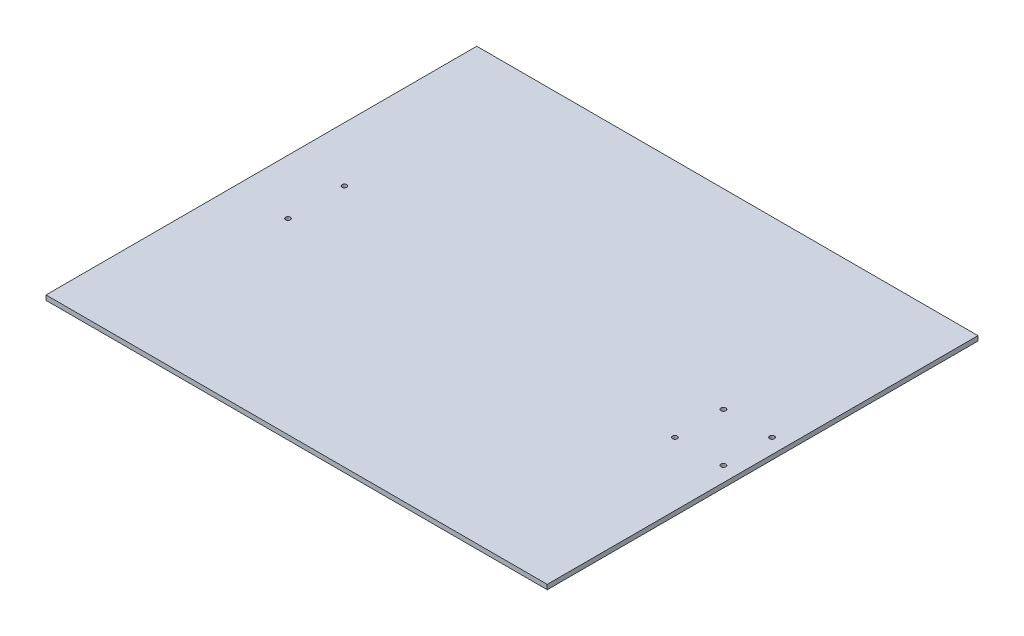
ISO-10303-21;
HEADER;
FILE_DESCRIPTION(('STEP AP214'),'2;1');
FILE_NAME('part.step','',(''),(''),'','','');
FILE_SCHEMA(('AUTOMOTIVE_DESIGN { 1 0 10303 214 1 1 1 1 }'));
ENDSEC;
DATA;
#1=APPLICATION_CONTEXT('core data for automotive mechanical design processes');
#2=APPLICATION_PROTOCOL_DEFINITION('international standard','automotive_design',2000,#1);
#3=PRODUCT_CONTEXT('',#1,'mechanical');
#4=PRODUCT('Part','Part','',(#3));
#5=PRODUCT_RELATED_PRODUCT_CATEGORY('part','',(#4));
#6=PRODUCT_DEFINITION_FORMATION('','',#4);
#7=PRODUCT_DEFINITION_CONTEXT('part definition',#1,'design');
#8=PRODUCT_DEFINITION('design','',#6,#7);
#9=PRODUCT_DEFINITION_SHAPE('','',#8);
#10=(LENGTH_UNIT() NAMED_UNIT(*) SI_UNIT(.MILLI.,.METRE.));
#11=(NAMED_UNIT(*) PLANE_ANGLE_UNIT() SI_UNIT($,.RADIAN.));
#12=(NAMED_UNIT(*) SI_UNIT($,.STERADIAN.) SOLID_ANGLE_UNIT());
#13=UNCERTAINTY_MEASURE_WITH_UNIT(LENGTH_MEASURE(1.E-05),#10,'distance_accuracy_value','');
#14=(GEOMETRIC_REPRESENTATION_CONTEXT(3) GLOBAL_UNCERTAINTY_ASSIGNED_CONTEXT((#13)) GLOBAL_UNIT_ASSIGNED_CONTEXT((#10,
#11,#12)) REPRESENTATION_CONTEXT('',''));
#15=CARTESIAN_POINT('',(0.,0.,0.));
#16=DIRECTION('',(0.,0.,1.));
#17=DIRECTION('',(1.,0.,0.));
#18=AXIS2_PLACEMENT_3D('',#15,#16,#17);
#19=CARTESIAN_POINT('',(160.,3.,137.5));
#20=DIRECTION('',(-1.,0.,0.));
#21=DIRECTION('',(0.,0.,1.));
#22=AXIS2_PLACEMENT_3D('',#19,#20,#21);
#23=PLANE('',#22);
#24=DIRECTION('',(0.,0.,-1.));
#25=VECTOR('',#24,1.);
#26=CARTESIAN_POINT('',(160.,0.,137.5));
#27=LINE('',#26,#25);
#28=CARTESIAN_POINT('',(160.,0.,137.5));
#29=VERTEX_POINT('',#28);
#30=CARTESIAN_POINT('',(160.,0.,-137.5));
#31=VERTEX_POINT('',#30);
#32=EDGE_CURVE('E99',#29,#31,#27,.T.);
#33=ORIENTED_EDGE('',*,*,#32,.T.);
#34=DIRECTION('',(0.,-1.,0.));
#35=VECTOR('',#34,1.);
#36=CARTESIAN_POINT('',(160.,3.,-137.5));
#37=LINE('',#36,#35);
#38=CARTESIAN_POINT('',(160.,3.,-137.5));
#39=VERTEX_POINT('',#38);
#40=EDGE_CURVE('E11',#39,#31,#37,.T.);
#41=ORIENTED_EDGE('',*,*,#40,.F.);
#42=DIRECTION('',(0.,0.,-1.));
#43=VECTOR('',#42,1.);
#44=CARTESIAN_POINT('',(160.,3.,137.5));
#45=LINE('',#44,#43);
#46=CARTESIAN_POINT('',(160.,3.,137.5));
#47=VERTEX_POINT('',#46);
#48=EDGE_CURVE('E87',#47,#39,#45,.T.);
#49=ORIENTED_EDGE('',*,*,#48,.F.);
#50=DIRECTION('',(0.,-1.,0.));
#51=VECTOR('',#50,1.);
#52=CARTESIAN_POINT('',(160.,3.,137.5));
#53=LINE('',#52,#51);
#54=EDGE_CURVE('E95',#47,#29,#53,.T.);
#55=ORIENTED_EDGE('',*,*,#54,.T.);
#56=EDGE_LOOP('',(#33,#41,#49,#55));
#57=FACE_BOUND('',#56,.T.);
#58=ADVANCED_FACE('F36',(#57),#23,.F.);
#59=CARTESIAN_POINT('',(-160.,3.,-137.5));
#60=DIRECTION('',(0.,0.,1.));
#61=DIRECTION('',(1.,0.,0.));
#62=AXIS2_PLACEMENT_3D('',#59,#60,#61);
#63=PLANE('',#62);
#64=DIRECTION('',(-1.,0.,0.));
#65=VECTOR('',#64,1.);
#66=CARTESIAN_POINT('',(-160.,0.,-137.5));
#67=LINE('',#66,#65);
#68=CARTESIAN_POINT('',(-160.,0.,-137.5));
#69=VERTEX_POINT('',#68);
#70=EDGE_CURVE('E91',#31,#69,#67,.T.);
#71=ORIENTED_EDGE('',*,*,#70,.T.);
#72=DIRECTION('',(0.,-1.,0.));
#73=VECTOR('',#72,1.);
#74=CARTESIAN_POINT('',(-160.,3.,-137.5));
#75=LINE('',#74,#73);
#76=CARTESIAN_POINT('',(-160.,3.,-137.5));
#77=VERTEX_POINT('',#76);
#78=EDGE_CURVE('E44',#77,#69,#75,.T.);
#79=ORIENTED_EDGE('',*,*,#78,.F.);
#80=DIRECTION('',(-1.,0.,0.));
#81=VECTOR('',#80,1.);
#82=CARTESIAN_POINT('',(-160.,3.,-137.5));
#83=LINE('',#82,#81);
#84=EDGE_CURVE('E82',#39,#77,#83,.T.);
#85=ORIENTED_EDGE('',*,*,#84,.F.);
#86=ORIENTED_EDGE('',*,*,#40,.T.);
#87=EDGE_LOOP('',(#71,#79,#85,#86));
#88=FACE_BOUND('',#87,.T.);
#89=ADVANCED_FACE('F90',(#88),#63,.F.);
#90=CARTESIAN_POINT('',(-160.,3.,137.5));
#91=DIRECTION('',(1.,0.,0.));
#92=DIRECTION('',(0.,0.,-1.));
#93=AXIS2_PLACEMENT_3D('',#90,#91,#92);
#94=PLANE('',#93);
#95=DIRECTION('',(0.,0.,1.));
#96=VECTOR('',#95,1.);
#97=CARTESIAN_POINT('',(-160.,0.,137.5));
#98=LINE('',#97,#96);
#99=CARTESIAN_POINT('',(-160.,0.,137.5));
#100=VERTEX_POINT('',#99);
#101=EDGE_CURVE('E69',#69,#100,#98,.T.);
#102=ORIENTED_EDGE('',*,*,#101,.T.);
#103=DIRECTION('',(0.,-1.,0.));
#104=VECTOR('',#103,1.);
#105=CARTESIAN_POINT('',(-160.,3.,137.5));
#106=LINE('',#105,#104);
#107=CARTESIAN_POINT('',(-160.,3.,137.5));
#108=VERTEX_POINT('',#107);
#109=EDGE_CURVE('E92',#108,#100,#106,.T.);
#110=ORIENTED_EDGE('',*,*,#109,.F.);
#111=DIRECTION('',(0.,0.,1.));
#112=VECTOR('',#111,1.);
#113=CARTESIAN_POINT('',(-160.,3.,137.5));
#114=LINE('',#113,#112);
#115=EDGE_CURVE('E85',#77,#108,#114,.T.);
#116=ORIENTED_EDGE('',*,*,#115,.F.);
#117=ORIENTED_EDGE('',*,*,#78,.T.);
#118=EDGE_LOOP('',(#102,#110,#116,#117));
#119=FACE_BOUND('',#118,.T.);
#120=ADVANCED_FACE('F93',(#119),#94,.F.);
#121=CARTESIAN_POINT('',(-160.,3.,137.5));
#122=DIRECTION('',(0.,0.,-1.));
#123=DIRECTION('',(-1.,0.,0.));
#124=AXIS2_PLACEMENT_3D('',#121,#122,#123);
#125=PLANE('',#124);
#126=DIRECTION('',(1.,0.,0.));
#127=VECTOR('',#126,1.);
#128=CARTESIAN_POINT('',(-160.,0.,137.5));
#129=LINE('',#128,#127);
#130=EDGE_CURVE('E75',#100,#29,#129,.T.);
#131=ORIENTED_EDGE('',*,*,#130,.T.);
#132=ORIENTED_EDGE('',*,*,#54,.F.);
#133=DIRECTION('',(1.,0.,0.));
#134=VECTOR('',#133,1.);
#135=CARTESIAN_POINT('',(-160.,3.,137.5));
#136=LINE('',#135,#134);
#137=EDGE_CURVE('E52',#108,#47,#136,.T.);
#138=ORIENTED_EDGE('',*,*,#137,.F.);
#139=ORIENTED_EDGE('',*,*,#109,.T.);
#140=EDGE_LOOP('',(#131,#132,#138,#139));
#141=FACE_BOUND('',#140,.T.);
#142=ADVANCED_FACE('F107',(#141),#125,.F.);
#143=CARTESIAN_POINT('',(0.,3.,0.));
#144=DIRECTION('',(0.,-1.,0.));
#145=DIRECTION('',(0.,0.,-1.));
#146=AXIS2_PLACEMENT_3D('',#143,#144,#145);
#147=PLANE('',#146);
#148=CARTESIAN_POINT('',(-125.,3.,18.));
#149=DIRECTION('',(0.,1.,0.));
#150=DIRECTION('',(0.,0.,1.));
#151=AXIS2_PLACEMENT_3D('',#148,#149,#150);
#152=CIRCLE('',#151,1.50000000000003);
#153=CARTESIAN_POINT('',(-125.,3.,19.5));
#154=VERTEX_POINT('',#153);
#155=EDGE_CURVE('E143',#154,#154,#152,.T.);
#156=ORIENTED_EDGE('',*,*,#155,.F.);
#157=EDGE_LOOP('',(#156));
#158=FACE_BOUND('',#157,.T.);
#159=CARTESIAN_POINT('',(-125.,3.,-18.));
#160=DIRECTION('',(0.,1.,0.));
#161=DIRECTION('',(0.,0.,1.));
#162=AXIS2_PLACEMENT_3D('',#159,#160,#161);
#163=CIRCLE('',#162,1.50000000000003);
#164=CARTESIAN_POINT('',(-125.,3.,-16.5));
#165=VERTEX_POINT('',#164);
#166=EDGE_CURVE('E140',#165,#165,#163,.T.);
#167=ORIENTED_EDGE('',*,*,#166,.F.);
#168=EDGE_LOOP('',(#167));
#169=FACE_BOUND('',#168,.T.);
#170=CARTESIAN_POINT('',(150.5,3.,-15.5));
#171=DIRECTION('',(0.,1.,0.));
#172=DIRECTION('',(0.,0.,1.));
#173=AXIS2_PLACEMENT_3D('',#170,#171,#172);
#174=CIRCLE('',#173,1.55);
#175=CARTESIAN_POINT('',(150.5,3.,-13.95));
#176=VERTEX_POINT('',#175);
#177=EDGE_CURVE('E133',#176,#176,#174,.T.);
#178=ORIENTED_EDGE('',*,*,#177,.F.);
#179=EDGE_LOOP('',(#178));
#180=FACE_BOUND('',#179,.T.);
#181=CARTESIAN_POINT('',(150.5,3.,15.5));
#182=DIRECTION('',(0.,1.,0.));
#183=DIRECTION('',(0.,0.,1.));
#184=AXIS2_PLACEMENT_3D('',#181,#182,#183);
#185=CIRCLE('',#184,1.55);
#186=CARTESIAN_POINT('',(150.5,3.,17.05));
#187=VERTEX_POINT('',#186);
#188=EDGE_CURVE('E127',#187,#187,#185,.T.);
#189=ORIENTED_EDGE('',*,*,#188,.F.);
#190=EDGE_LOOP('',(#189));
#191=FACE_BOUND('',#190,.T.);
#192=CARTESIAN_POINT('',(119.5,3.,15.5));
#193=DIRECTION('',(0.,1.,0.));
#194=DIRECTION('',(0.,0.,1.));
#195=AXIS2_PLACEMENT_3D('',#192,#193,#194);
#196=CIRCLE('',#195,1.55);
#197=CARTESIAN_POINT('',(119.5,3.,17.05));
#198=VERTEX_POINT('',#197);
#199=EDGE_CURVE('E121',#198,#198,#196,.T.);
#200=ORIENTED_EDGE('',*,*,#199,.F.);
#201=EDGE_LOOP('',(#200));
#202=FACE_BOUND('',#201,.T.);
#203=CARTESIAN_POINT('',(119.5,3.,-15.5));
#204=DIRECTION('',(0.,1.,0.));
#205=DIRECTION('',(0.,0.,1.));
#206=AXIS2_PLACEMENT_3D('',#203,#204,#205);
#207=CIRCLE('',#206,1.55);
#208=CARTESIAN_POINT('',(119.5,3.,-13.95));
#209=VERTEX_POINT('',#208);
#210=EDGE_CURVE('E115',#209,#209,#207,.T.);
#211=ORIENTED_EDGE('',*,*,#210,.F.);
#212=EDGE_LOOP('',(#211));
#213=FACE_BOUND('',#212,.T.);
#214=ORIENTED_EDGE('',*,*,#48,.T.);
#215=ORIENTED_EDGE('',*,*,#84,.T.);
#216=ORIENTED_EDGE('',*,*,#115,.T.);
#217=ORIENTED_EDGE('',*,*,#137,.T.);
#218=EDGE_LOOP('',(#214,#215,#216,#217));
#219=FACE_BOUND('',#218,.T.);
#220=ADVANCED_FACE('F83',(#158,#169,#180,#191,#202,#213,#219),#147,.F.);
#221=CARTESIAN_POINT('',(0.,0.,0.));
#222=DIRECTION('',(0.,-1.,0.));
#223=DIRECTION('',(0.,0.,-1.));
#224=AXIS2_PLACEMENT_3D('',#221,#222,#223);
#225=PLANE('',#224);
#226=CARTESIAN_POINT('',(-125.,0.,18.));
#227=DIRECTION('',(0.,1.,0.));
#228=DIRECTION('',(0.,0.,1.));
#229=AXIS2_PLACEMENT_3D('',#226,#227,#228);
#230=CIRCLE('',#229,1.50000000000003);
#231=CARTESIAN_POINT('',(-125.,0.,19.5));
#232=VERTEX_POINT('',#231);
#233=EDGE_CURVE('E136',#232,#232,#230,.T.);
#234=ORIENTED_EDGE('',*,*,#233,.T.);
#235=EDGE_LOOP('',(#234));
#236=FACE_BOUND('',#235,.T.);
#237=CARTESIAN_POINT('',(-125.,0.,-18.));
#238=DIRECTION('',(0.,1.,0.));
#239=DIRECTION('',(0.,0.,1.));
#240=AXIS2_PLACEMENT_3D('',#237,#238,#239);
#241=CIRCLE('',#240,1.50000000000003);
#242=CARTESIAN_POINT('',(-125.,0.,-16.5));
#243=VERTEX_POINT('',#242);
#244=EDGE_CURVE('E137',#243,#243,#241,.T.);
#245=ORIENTED_EDGE('',*,*,#244,.T.);
#246=EDGE_LOOP('',(#245));
#247=FACE_BOUND('',#246,.T.);
#248=CARTESIAN_POINT('',(150.5,0.,-15.5));
#249=DIRECTION('',(0.,1.,0.));
#250=DIRECTION('',(0.,0.,1.));
#251=AXIS2_PLACEMENT_3D('',#248,#249,#250);
#252=CIRCLE('',#251,1.55);
#253=CARTESIAN_POINT('',(150.5,0.,-13.95));
#254=VERTEX_POINT('',#253);
#255=EDGE_CURVE('E130',#254,#254,#252,.T.);
#256=ORIENTED_EDGE('',*,*,#255,.T.);
#257=EDGE_LOOP('',(#256));
#258=FACE_BOUND('',#257,.T.);
#259=CARTESIAN_POINT('',(150.5,0.,15.5));
#260=DIRECTION('',(0.,1.,0.));
#261=DIRECTION('',(0.,0.,1.));
#262=AXIS2_PLACEMENT_3D('',#259,#260,#261);
#263=CIRCLE('',#262,1.55);
#264=CARTESIAN_POINT('',(150.5,0.,17.05));
#265=VERTEX_POINT('',#264);
#266=EDGE_CURVE('E124',#265,#265,#263,.T.);
#267=ORIENTED_EDGE('',*,*,#266,.T.);
#268=EDGE_LOOP('',(#267));
#269=FACE_BOUND('',#268,.T.);
#270=CARTESIAN_POINT('',(119.5,0.,15.5));
#271=DIRECTION('',(0.,1.,0.));
#272=DIRECTION('',(0.,0.,1.));
#273=AXIS2_PLACEMENT_3D('',#270,#271,#272);
#274=CIRCLE('',#273,1.55);
#275=CARTESIAN_POINT('',(119.5,0.,17.05));
#276=VERTEX_POINT('',#275);
#277=EDGE_CURVE('E118',#276,#276,#274,.T.);
#278=ORIENTED_EDGE('',*,*,#277,.T.);
#279=EDGE_LOOP('',(#278));
#280=FACE_BOUND('',#279,.T.);
#281=CARTESIAN_POINT('',(119.5,0.,-15.5));
#282=DIRECTION('',(0.,1.,0.));
#283=DIRECTION('',(0.,0.,1.));
#284=AXIS2_PLACEMENT_3D('',#281,#282,#283);
#285=CIRCLE('',#284,1.55);
#286=CARTESIAN_POINT('',(119.5,0.,-13.95));
#287=VERTEX_POINT('',#286);
#288=EDGE_CURVE('E102',#287,#287,#285,.T.);
#289=ORIENTED_EDGE('',*,*,#288,.T.);
#290=EDGE_LOOP('',(#289));
#291=FACE_BOUND('',#290,.T.);
#292=ORIENTED_EDGE('',*,*,#32,.F.);
#293=ORIENTED_EDGE('',*,*,#130,.F.);
#294=ORIENTED_EDGE('',*,*,#101,.F.);
#295=ORIENTED_EDGE('',*,*,#70,.F.);
#296=EDGE_LOOP('',(#292,#293,#294,#295));
#297=FACE_BOUND('',#296,.T.);
#298=ADVANCED_FACE('F110',(#236,#247,#258,#269,#280,#291,#297),#225,.T.);
#299=CARTESIAN_POINT('',(119.5,3.,-15.5));
#300=DIRECTION('',(0.,1.,0.));
#301=DIRECTION('',(0.,0.,1.));
#302=AXIS2_PLACEMENT_3D('',#299,#300,#301);
#303=CYLINDRICAL_SURFACE('',#302,1.55);
#304=ORIENTED_EDGE('',*,*,#288,.F.);
#305=EDGE_LOOP('',(#304));
#306=FACE_BOUND('',#305,.T.);
#307=ORIENTED_EDGE('',*,*,#210,.T.);
#308=EDGE_LOOP('',(#307));
#309=FACE_BOUND('',#308,.T.);
#310=ADVANCED_FACE('F171',(#306,#309),#303,.F.);
#311=CARTESIAN_POINT('',(119.5,3.,15.5));
#312=DIRECTION('',(0.,1.,0.));
#313=DIRECTION('',(0.,0.,1.));
#314=AXIS2_PLACEMENT_3D('',#311,#312,#313);
#315=CYLINDRICAL_SURFACE('',#314,1.55);
#316=ORIENTED_EDGE('',*,*,#277,.F.);
#317=EDGE_LOOP('',(#316));
#318=FACE_BOUND('',#317,.T.);
#319=ORIENTED_EDGE('',*,*,#199,.T.);
#320=EDGE_LOOP('',(#319));
#321=FACE_BOUND('',#320,.T.);
#322=ADVANCED_FACE('F173',(#318,#321),#315,.F.);
#323=CARTESIAN_POINT('',(150.5,3.,15.5));
#324=DIRECTION('',(0.,1.,0.));
#325=DIRECTION('',(0.,0.,1.));
#326=AXIS2_PLACEMENT_3D('',#323,#324,#325);
#327=CYLINDRICAL_SURFACE('',#326,1.55);
#328=ORIENTED_EDGE('',*,*,#266,.F.);
#329=EDGE_LOOP('',(#328));
#330=FACE_BOUND('',#329,.T.);
#331=ORIENTED_EDGE('',*,*,#188,.T.);
#332=EDGE_LOOP('',(#331));
#333=FACE_BOUND('',#332,.T.);
#334=ADVANCED_FACE('F180',(#330,#333),#327,.F.);
#335=CARTESIAN_POINT('',(150.5,3.,-15.5));
#336=DIRECTION('',(0.,1.,0.));
#337=DIRECTION('',(0.,0.,1.));
#338=AXIS2_PLACEMENT_3D('',#335,#336,#337);
#339=CYLINDRICAL_SURFACE('',#338,1.55);
#340=ORIENTED_EDGE('',*,*,#255,.F.);
#341=EDGE_LOOP('',(#340));
#342=FACE_BOUND('',#341,.T.);
#343=ORIENTED_EDGE('',*,*,#177,.T.);
#344=EDGE_LOOP('',(#343));
#345=FACE_BOUND('',#344,.T.);
#346=ADVANCED_FACE('F219',(#342,#345),#339,.F.);
#347=CARTESIAN_POINT('',(-125.,0.,-18.));
#348=DIRECTION('',(0.,1.,0.));
#349=DIRECTION('',(0.,0.,1.));
#350=AXIS2_PLACEMENT_3D('',#347,#348,#349);
#351=CYLINDRICAL_SURFACE('',#350,1.50000000000003);
#352=ORIENTED_EDGE('',*,*,#244,.F.);
#353=EDGE_LOOP('',(#352));
#354=FACE_BOUND('',#353,.T.);
#355=ORIENTED_EDGE('',*,*,#166,.T.);
#356=EDGE_LOOP('',(#355));
#357=FACE_BOUND('',#356,.T.);
#358=ADVANCED_FACE('F154',(#354,#357),#351,.F.);
#359=CARTESIAN_POINT('',(-125.,0.,18.));
#360=DIRECTION('',(0.,1.,0.));
#361=DIRECTION('',(0.,0.,1.));
#362=AXIS2_PLACEMENT_3D('',#359,#360,#361);
#363=CYLINDRICAL_SURFACE('',#362,1.50000000000003);
#364=ORIENTED_EDGE('',*,*,#233,.F.);
#365=EDGE_LOOP('',(#364));
#366=FACE_BOUND('',#365,.T.);
#367=ORIENTED_EDGE('',*,*,#155,.T.);
#368=EDGE_LOOP('',(#367));
#369=FACE_BOUND('',#368,.T.);
#370=ADVANCED_FACE('F151',(#366,#369),#363,.F.);
#371=CLOSED_SHELL('',(#58,#89,#120,#142,#220,#298,#310,#322,#334,#346,#358,#370));
#372=MANIFOLD_SOLID_BREP('B2',#371);
#373=ADVANCED_BREP_SHAPE_REPRESENTATION('',(#18,#372),#14);
#374=SHAPE_DEFINITION_REPRESENTATION(#9,#373);
ENDSEC;
END-ISO-10303-21;
